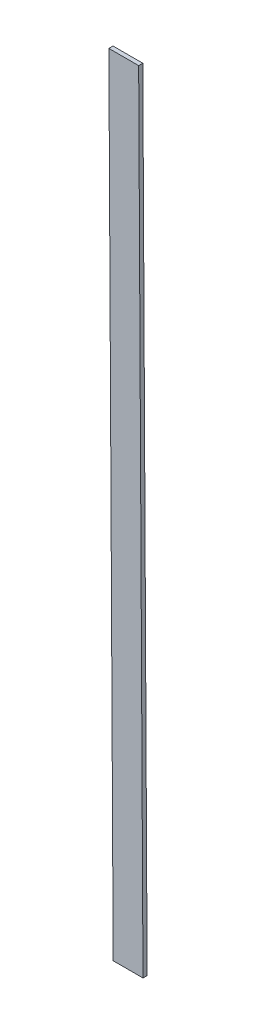
ISO-10303-21;
HEADER;
FILE_DESCRIPTION(('STEP AP214'),'2;1');
FILE_NAME('part.step','',(''),(''),'','','');
FILE_SCHEMA(('AUTOMOTIVE_DESIGN { 1 0 10303 214 1 1 1 1 }'));
ENDSEC;
DATA;
#1=APPLICATION_CONTEXT('core data for automotive mechanical design processes');
#2=APPLICATION_PROTOCOL_DEFINITION('international standard','automotive_design',2000,#1);
#3=PRODUCT_CONTEXT('',#1,'mechanical');
#4=PRODUCT('Part','Part','',(#3));
#5=PRODUCT_RELATED_PRODUCT_CATEGORY('part','',(#4));
#6=PRODUCT_DEFINITION_FORMATION('','',#4);
#7=PRODUCT_DEFINITION_CONTEXT('part definition',#1,'design');
#8=PRODUCT_DEFINITION('design','',#6,#7);
#9=PRODUCT_DEFINITION_SHAPE('','',#8);
#10=(LENGTH_UNIT() NAMED_UNIT(*) SI_UNIT(.MILLI.,.METRE.));
#11=(NAMED_UNIT(*) PLANE_ANGLE_UNIT() SI_UNIT($,.RADIAN.));
#12=(NAMED_UNIT(*) SI_UNIT($,.STERADIAN.) SOLID_ANGLE_UNIT());
#13=UNCERTAINTY_MEASURE_WITH_UNIT(LENGTH_MEASURE(1.E-05),#10,'distance_accuracy_value','');
#14=(GEOMETRIC_REPRESENTATION_CONTEXT(3) GLOBAL_UNCERTAINTY_ASSIGNED_CONTEXT((#13)) GLOBAL_UNIT_ASSIGNED_CONTEXT((#10,
#11,#12)) REPRESENTATION_CONTEXT('',''));
#15=CARTESIAN_POINT('',(0.,0.,0.));
#16=DIRECTION('',(0.,0.,1.));
#17=DIRECTION('',(1.,0.,0.));
#18=AXIS2_PLACEMENT_3D('',#15,#16,#17);
#19=CARTESIAN_POINT('',(-27.7283410661809,213.806796442236,1.5875));
#20=DIRECTION('',(0.,1.,0.));
#21=DIRECTION('',(-1.,0.,0.));
#22=AXIS2_PLACEMENT_3D('',#19,#20,#21);
#23=PLANE('',#22);
#24=DIRECTION('',(1.,0.,0.));
#25=VECTOR('',#24,1.);
#26=CARTESIAN_POINT('',(-27.7283410661809,213.806796442236,0.));
#27=LINE('',#26,#25);
#28=CARTESIAN_POINT('',(-27.7283410661809,213.806796442236,0.));
#29=VERTEX_POINT('',#28);
#30=CARTESIAN_POINT('',(-16.294422033005,213.806796442236,0.));
#31=VERTEX_POINT('',#30);
#32=EDGE_CURVE('E96',#29,#31,#27,.T.);
#33=ORIENTED_EDGE('',*,*,#32,.F.);
#34=DIRECTION('',(0.,0.,-1.));
#35=VECTOR('',#34,1.);
#36=CARTESIAN_POINT('',(-27.7283410661809,213.806796442236,1.5875));
#37=LINE('',#36,#35);
#38=CARTESIAN_POINT('',(-27.7283410661809,213.806796442236,1.5875));
#39=VERTEX_POINT('',#38);
#40=EDGE_CURVE('E11',#39,#29,#37,.T.);
#41=ORIENTED_EDGE('',*,*,#40,.F.);
#42=DIRECTION('',(1.,0.,0.));
#43=VECTOR('',#42,1.);
#44=CARTESIAN_POINT('',(-27.7283410661809,213.806796442236,1.5875));
#45=LINE('',#44,#43);
#46=CARTESIAN_POINT('',(-16.294422033005,213.806796442236,1.5875));
#47=VERTEX_POINT('',#46);
#48=EDGE_CURVE('E90',#39,#47,#45,.T.);
#49=ORIENTED_EDGE('',*,*,#48,.T.);
#50=DIRECTION('',(0.,0.,-1.));
#51=VECTOR('',#50,1.);
#52=CARTESIAN_POINT('',(-16.294422033005,213.806796442236,1.5875));
#53=LINE('',#52,#51);
#54=EDGE_CURVE('E35',#47,#31,#53,.T.);
#55=ORIENTED_EDGE('',*,*,#54,.T.);
#56=EDGE_LOOP('',(#33,#41,#49,#55));
#57=FACE_BOUND('',#56,.T.);
#58=ADVANCED_FACE('F32',(#57),#23,.T.);
#59=CARTESIAN_POINT('',(-26.063119292294,-88.4603266394169,1.5875));
#60=DIRECTION('',(-0.999984825218179,-0.00550902290508106,0.));
#61=DIRECTION('',(0.00550902290508106,-0.999984825218179,0.));
#62=AXIS2_PLACEMENT_3D('',#59,#60,#61);
#63=PLANE('',#62);
#64=DIRECTION('',(-0.00550902290508106,0.999984825218179,0.));
#65=VECTOR('',#64,1.);
#66=CARTESIAN_POINT('',(-26.063119292294,-88.4603266394169,0.));
#67=LINE('',#66,#65);
#68=CARTESIAN_POINT('',(-26.063119292294,-88.4603266394169,0.));
#69=VERTEX_POINT('',#68);
#70=EDGE_CURVE('E92',#69,#29,#67,.T.);
#71=ORIENTED_EDGE('',*,*,#70,.F.);
#72=DIRECTION('',(0.,0.,-1.));
#73=VECTOR('',#72,1.);
#74=CARTESIAN_POINT('',(-26.063119292294,-88.4603266394169,1.5875));
#75=LINE('',#74,#73);
#76=CARTESIAN_POINT('',(-26.063119292294,-88.4603266394169,1.5875));
#77=VERTEX_POINT('',#76);
#78=EDGE_CURVE('E41',#77,#69,#75,.T.);
#79=ORIENTED_EDGE('',*,*,#78,.F.);
#80=DIRECTION('',(-0.00550902290508106,0.999984825218179,0.));
#81=VECTOR('',#80,1.);
#82=CARTESIAN_POINT('',(-26.063119292294,-88.4603266394169,1.5875));
#83=LINE('',#82,#81);
#84=EDGE_CURVE('E87',#77,#39,#83,.T.);
#85=ORIENTED_EDGE('',*,*,#84,.T.);
#86=ORIENTED_EDGE('',*,*,#40,.T.);
#87=EDGE_LOOP('',(#71,#79,#85,#86));
#88=FACE_BOUND('',#87,.T.);
#89=ADVANCED_FACE('F106',(#88),#63,.T.);
#90=CARTESIAN_POINT('',(-14.6292050686024,-88.4603266394169,1.5875));
#91=DIRECTION('',(0.,-1.,0.));
#92=DIRECTION('',(1.,0.,0.));
#93=AXIS2_PLACEMENT_3D('',#90,#91,#92);
#94=PLANE('',#93);
#95=DIRECTION('',(-1.,0.,0.));
#96=VECTOR('',#95,1.);
#97=CARTESIAN_POINT('',(-14.6292050686024,-88.4603266394169,0.));
#98=LINE('',#97,#96);
#99=CARTESIAN_POINT('',(-14.6292050686024,-88.4603266394169,0.));
#100=VERTEX_POINT('',#99);
#101=EDGE_CURVE('E82',#100,#69,#98,.T.);
#102=ORIENTED_EDGE('',*,*,#101,.F.);
#103=DIRECTION('',(0.,0.,-1.));
#104=VECTOR('',#103,1.);
#105=CARTESIAN_POINT('',(-14.6292050686024,-88.4603266394169,1.5875));
#106=LINE('',#105,#104);
#107=CARTESIAN_POINT('',(-14.6292050686024,-88.4603266394169,1.5875));
#108=VERTEX_POINT('',#107);
#109=EDGE_CURVE('E77',#108,#100,#106,.T.);
#110=ORIENTED_EDGE('',*,*,#109,.F.);
#111=DIRECTION('',(-1.,0.,0.));
#112=VECTOR('',#111,1.);
#113=CARTESIAN_POINT('',(-14.6292050686024,-88.4603266394169,1.5875));
#114=LINE('',#113,#112);
#115=EDGE_CURVE('E80',#108,#77,#114,.T.);
#116=ORIENTED_EDGE('',*,*,#115,.T.);
#117=ORIENTED_EDGE('',*,*,#78,.T.);
#118=EDGE_LOOP('',(#102,#110,#116,#117));
#119=FACE_BOUND('',#118,.T.);
#120=ADVANCED_FACE('F79',(#119),#94,.T.);
#121=CARTESIAN_POINT('',(-16.294422033005,213.806796442236,1.5875));
#122=DIRECTION('',(0.999984825305832,0.00550900699443455,0.));
#123=DIRECTION('',(-0.00550900699443455,0.999984825305832,0.));
#124=AXIS2_PLACEMENT_3D('',#121,#122,#123);
#125=PLANE('',#124);
#126=DIRECTION('',(0.00550900699443455,-0.999984825305832,0.));
#127=VECTOR('',#126,1.);
#128=CARTESIAN_POINT('',(-16.294422033005,213.806796442236,0.));
#129=LINE('',#128,#127);
#130=EDGE_CURVE('E99',#31,#100,#129,.T.);
#131=ORIENTED_EDGE('',*,*,#130,.F.);
#132=ORIENTED_EDGE('',*,*,#54,.F.);
#133=DIRECTION('',(0.00550900699443455,-0.999984825305832,0.));
#134=VECTOR('',#133,1.);
#135=CARTESIAN_POINT('',(-16.294422033005,213.806796442236,1.5875));
#136=LINE('',#135,#134);
#137=EDGE_CURVE('E86',#47,#108,#136,.T.);
#138=ORIENTED_EDGE('',*,*,#137,.T.);
#139=ORIENTED_EDGE('',*,*,#109,.T.);
#140=EDGE_LOOP('',(#131,#132,#138,#139));
#141=FACE_BOUND('',#140,.T.);
#142=ADVANCED_FACE('F89',(#141),#125,.T.);
#143=CARTESIAN_POINT('',(0.,0.,1.5875));
#144=DIRECTION('',(0.,0.,-1.));
#145=DIRECTION('',(-1.,0.,0.));
#146=AXIS2_PLACEMENT_3D('',#143,#144,#145);
#147=PLANE('',#146);
#148=ORIENTED_EDGE('',*,*,#48,.F.);
#149=ORIENTED_EDGE('',*,*,#84,.F.);
#150=ORIENTED_EDGE('',*,*,#115,.F.);
#151=ORIENTED_EDGE('',*,*,#137,.F.);
#152=EDGE_LOOP('',(#148,#149,#150,#151));
#153=FACE_BOUND('',#152,.T.);
#154=ADVANCED_FACE('F85',(#153),#147,.F.);
#155=CARTESIAN_POINT('',(0.,0.,0.));
#156=DIRECTION('',(0.,0.,-1.));
#157=DIRECTION('',(-1.,0.,0.));
#158=AXIS2_PLACEMENT_3D('',#155,#156,#157);
#159=PLANE('',#158);
#160=ORIENTED_EDGE('',*,*,#32,.T.);
#161=ORIENTED_EDGE('',*,*,#130,.T.);
#162=ORIENTED_EDGE('',*,*,#101,.T.);
#163=ORIENTED_EDGE('',*,*,#70,.T.);
#164=EDGE_LOOP('',(#160,#161,#162,#163));
#165=FACE_BOUND('',#164,.T.);
#166=ADVANCED_FACE('F105',(#165),#159,.T.);
#167=CLOSED_SHELL('',(#58,#89,#120,#142,#154,#166));
#168=MANIFOLD_SOLID_BREP('B2',#167);
#169=ADVANCED_BREP_SHAPE_REPRESENTATION('',(#18,#168),#14);
#170=SHAPE_DEFINITION_REPRESENTATION(#9,#169);
ENDSEC;
END-ISO-10303-21;
